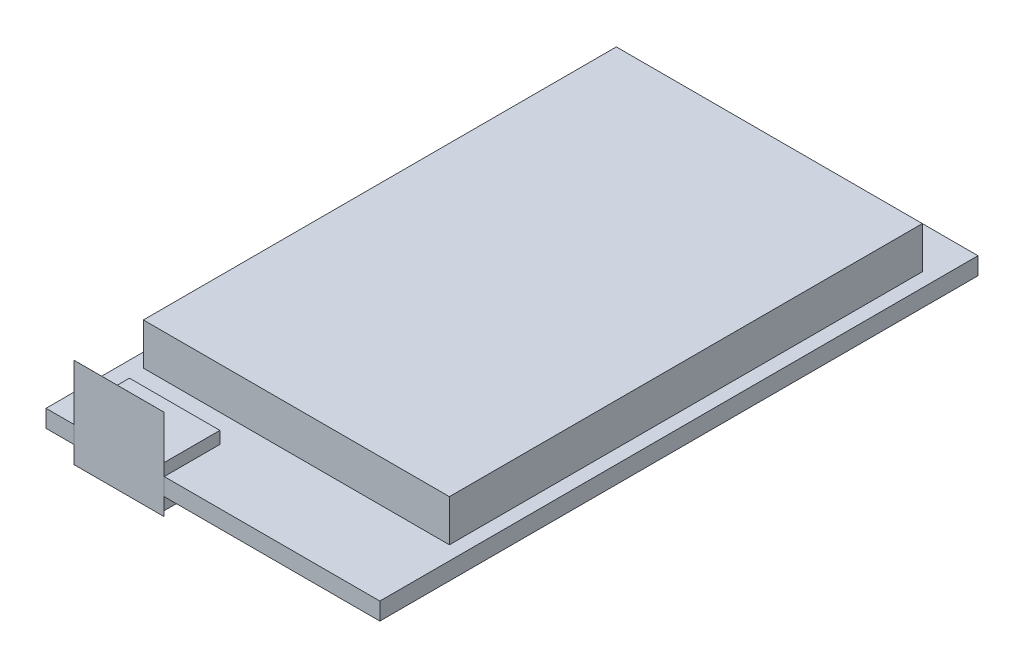
ISO-10303-21;
HEADER;
FILE_DESCRIPTION(('STEP AP214'),'2;1');
FILE_NAME('part.step','',(''),(''),'','','');
FILE_SCHEMA(('AUTOMOTIVE_DESIGN { 1 0 10303 214 1 1 1 1 }'));
ENDSEC;
DATA;
#1=APPLICATION_CONTEXT('core data for automotive mechanical design processes');
#2=APPLICATION_PROTOCOL_DEFINITION('international standard','automotive_design',2000,#1);
#3=PRODUCT_CONTEXT('',#1,'mechanical');
#4=PRODUCT('Part','Part','',(#3));
#5=PRODUCT_RELATED_PRODUCT_CATEGORY('part','',(#4));
#6=PRODUCT_DEFINITION_FORMATION('','',#4);
#7=PRODUCT_DEFINITION_CONTEXT('part definition',#1,'design');
#8=PRODUCT_DEFINITION('design','',#6,#7);
#9=PRODUCT_DEFINITION_SHAPE('','',#8);
#10=(LENGTH_UNIT() NAMED_UNIT(*) SI_UNIT(.MILLI.,.METRE.));
#11=(NAMED_UNIT(*) PLANE_ANGLE_UNIT() SI_UNIT($,.RADIAN.));
#12=(NAMED_UNIT(*) SI_UNIT($,.STERADIAN.) SOLID_ANGLE_UNIT());
#13=UNCERTAINTY_MEASURE_WITH_UNIT(LENGTH_MEASURE(1.E-05),#10,'distance_accuracy_value','');
#14=(GEOMETRIC_REPRESENTATION_CONTEXT(3) GLOBAL_UNCERTAINTY_ASSIGNED_CONTEXT((#13)) GLOBAL_UNIT_ASSIGNED_CONTEXT((#10,
#11,#12)) REPRESENTATION_CONTEXT('',''));
#15=CARTESIAN_POINT('',(0.,0.,0.));
#16=DIRECTION('',(0.,0.,1.));
#17=DIRECTION('',(1.,0.,0.));
#18=AXIS2_PLACEMENT_3D('',#15,#16,#17);
#19=CARTESIAN_POINT('',(0.,1.25,0.));
#20=DIRECTION('',(0.,1.,0.));
#21=DIRECTION('',(0.,0.,1.));
#22=AXIS2_PLACEMENT_3D('',#19,#20,#21);
#23=PLANE('',#22);
#24=DIRECTION('',(0.,0.,-1.));
#25=VECTOR('',#24,1.);
#26=CARTESIAN_POINT('',(11.,1.25,-18.5));
#27=LINE('',#26,#25);
#28=CARTESIAN_POINT('',(11.,1.25,15.5));
#29=VERTEX_POINT('',#28);
#30=CARTESIAN_POINT('',(11.,1.25,-18.5));
#31=VERTEX_POINT('',#30);
#32=EDGE_CURVE('E241',#29,#31,#27,.T.);
#33=ORIENTED_EDGE('',*,*,#32,.F.);
#34=DIRECTION('',(1.,0.,0.));
#35=VECTOR('',#34,1.);
#36=CARTESIAN_POINT('',(-11.,1.25,15.5));
#37=LINE('',#36,#35);
#38=CARTESIAN_POINT('',(-11.,1.25,15.5));
#39=VERTEX_POINT('',#38);
#40=EDGE_CURVE('E246',#39,#29,#37,.T.);
#41=ORIENTED_EDGE('',*,*,#40,.F.);
#42=DIRECTION('',(0.,0.,1.));
#43=VECTOR('',#42,1.);
#44=CARTESIAN_POINT('',(-11.,1.25,-18.5));
#45=LINE('',#44,#43);
#46=CARTESIAN_POINT('',(-11.,1.25,-18.5));
#47=VERTEX_POINT('',#46);
#48=EDGE_CURVE('E258',#47,#39,#45,.T.);
#49=ORIENTED_EDGE('',*,*,#48,.F.);
#50=DIRECTION('',(-1.,0.,0.));
#51=VECTOR('',#50,1.);
#52=CARTESIAN_POINT('',(-11.,1.25,-18.5));
#53=LINE('',#52,#51);
#54=EDGE_CURVE('E255',#31,#47,#53,.T.);
#55=ORIENTED_EDGE('',*,*,#54,.F.);
#56=EDGE_LOOP('',(#33,#41,#49,#55));
#57=FACE_BOUND('',#56,.T.);
#58=DIRECTION('',(1.,0.,0.));
#59=VECTOR('',#58,1.);
#60=CARTESIAN_POINT('',(-12.,1.25,21.5));
#61=LINE('',#60,#59);
#62=CARTESIAN_POINT('',(-12.,1.25,21.5));
#63=VERTEX_POINT('',#62);
#64=CARTESIAN_POINT('',(-10.,1.25,21.5));
#65=VERTEX_POINT('',#64);
#66=EDGE_CURVE('E284',#63,#65,#61,.T.);
#67=ORIENTED_EDGE('',*,*,#66,.T.);
#68=DIRECTION('',(0.,0.,-1.));
#69=VECTOR('',#68,1.);
#70=CARTESIAN_POINT('',(-10.,1.25,0.));
#71=LINE('',#70,#69);
#72=CARTESIAN_POINT('',(-10.,1.25,17.5));
#73=VERTEX_POINT('',#72);
#74=EDGE_CURVE('E207',#65,#73,#71,.T.);
#75=ORIENTED_EDGE('',*,*,#74,.T.);
#76=DIRECTION('',(-1.,0.,0.));
#77=VECTOR('',#76,1.);
#78=CARTESIAN_POINT('',(0.,1.25,17.5));
#79=LINE('',#78,#77);
#80=CARTESIAN_POINT('',(-3.5,1.25,17.5));
#81=VERTEX_POINT('',#80);
#82=EDGE_CURVE('E179',#81,#73,#79,.T.);
#83=ORIENTED_EDGE('',*,*,#82,.F.);
#84=DIRECTION('',(0.,0.,1.));
#85=VECTOR('',#84,1.);
#86=CARTESIAN_POINT('',(-3.5,1.25,0.));
#87=LINE('',#86,#85);
#88=CARTESIAN_POINT('',(-3.5,1.25,21.5));
#89=VERTEX_POINT('',#88);
#90=EDGE_CURVE('E198',#81,#89,#87,.T.);
#91=ORIENTED_EDGE('',*,*,#90,.T.);
#92=CARTESIAN_POINT('',(12.,1.25,21.5));
#93=VERTEX_POINT('',#92);
#94=EDGE_CURVE('E283',#89,#93,#61,.T.);
#95=ORIENTED_EDGE('',*,*,#94,.T.);
#96=DIRECTION('',(0.,0.,-1.));
#97=VECTOR('',#96,1.);
#98=CARTESIAN_POINT('',(12.,1.25,-21.5));
#99=LINE('',#98,#97);
#100=CARTESIAN_POINT('',(12.,1.25,-21.5));
#101=VERTEX_POINT('',#100);
#102=EDGE_CURVE('E275',#93,#101,#99,.T.);
#103=ORIENTED_EDGE('',*,*,#102,.T.);
#104=DIRECTION('',(-1.,0.,0.));
#105=VECTOR('',#104,1.);
#106=CARTESIAN_POINT('',(-12.,1.25,-21.5));
#107=LINE('',#106,#105);
#108=CARTESIAN_POINT('',(-12.,1.25,-21.5));
#109=VERTEX_POINT('',#108);
#110=EDGE_CURVE('E278',#101,#109,#107,.T.);
#111=ORIENTED_EDGE('',*,*,#110,.T.);
#112=DIRECTION('',(0.,0.,1.));
#113=VECTOR('',#112,1.);
#114=CARTESIAN_POINT('',(-12.,1.25,-21.5));
#115=LINE('',#114,#113);
#116=EDGE_CURVE('E281',#109,#63,#115,.T.);
#117=ORIENTED_EDGE('',*,*,#116,.T.);
#118=EDGE_LOOP('',(#67,#75,#83,#91,#95,#103,#111,#117));
#119=FACE_BOUND('',#118,.T.);
#120=ADVANCED_FACE('F35',(#57,#119),#23,.T.);
#121=CARTESIAN_POINT('',(0.,0.,0.));
#122=DIRECTION('',(0.,1.,0.));
#123=DIRECTION('',(0.,0.,1.));
#124=AXIS2_PLACEMENT_3D('',#121,#122,#123);
#125=PLANE('',#124);
#126=DIRECTION('',(0.,0.,-1.));
#127=VECTOR('',#126,1.);
#128=CARTESIAN_POINT('',(-10.,0.,0.));
#129=LINE('',#128,#127);
#130=CARTESIAN_POINT('',(-10.,0.,21.5));
#131=VERTEX_POINT('',#130);
#132=CARTESIAN_POINT('',(-10.,0.,17.5));
#133=VERTEX_POINT('',#132);
#134=EDGE_CURVE('E205',#131,#133,#129,.T.);
#135=ORIENTED_EDGE('',*,*,#134,.F.);
#136=DIRECTION('',(1.,0.,0.));
#137=VECTOR('',#136,1.);
#138=CARTESIAN_POINT('',(-12.,0.,21.5));
#139=LINE('',#138,#137);
#140=CARTESIAN_POINT('',(-12.,0.,21.5));
#141=VERTEX_POINT('',#140);
#142=EDGE_CURVE('E279',#141,#131,#139,.T.);
#143=ORIENTED_EDGE('',*,*,#142,.F.);
#144=DIRECTION('',(0.,0.,1.));
#145=VECTOR('',#144,1.);
#146=CARTESIAN_POINT('',(-12.,0.,-21.5));
#147=LINE('',#146,#145);
#148=CARTESIAN_POINT('',(-12.,0.,-21.5));
#149=VERTEX_POINT('',#148);
#150=EDGE_CURVE('E292',#149,#141,#147,.T.);
#151=ORIENTED_EDGE('',*,*,#150,.F.);
#152=DIRECTION('',(-1.,0.,0.));
#153=VECTOR('',#152,1.);
#154=CARTESIAN_POINT('',(-12.,0.,-21.5));
#155=LINE('',#154,#153);
#156=CARTESIAN_POINT('',(12.,0.,-21.5));
#157=VERTEX_POINT('',#156);
#158=EDGE_CURVE('E290',#157,#149,#155,.T.);
#159=ORIENTED_EDGE('',*,*,#158,.F.);
#160=DIRECTION('',(0.,0.,-1.));
#161=VECTOR('',#160,1.);
#162=CARTESIAN_POINT('',(12.,0.,-21.5));
#163=LINE('',#162,#161);
#164=CARTESIAN_POINT('',(12.,0.,21.5));
#165=VERTEX_POINT('',#164);
#166=EDGE_CURVE('E274',#165,#157,#163,.T.);
#167=ORIENTED_EDGE('',*,*,#166,.F.);
#168=CARTESIAN_POINT('',(-3.5,0.,21.5));
#169=VERTEX_POINT('',#168);
#170=EDGE_CURVE('E294',#169,#165,#139,.T.);
#171=ORIENTED_EDGE('',*,*,#170,.F.);
#172=DIRECTION('',(0.,0.,1.));
#173=VECTOR('',#172,1.);
#174=CARTESIAN_POINT('',(-3.5,0.,0.));
#175=LINE('',#174,#173);
#176=CARTESIAN_POINT('',(-3.5,0.,17.5));
#177=VERTEX_POINT('',#176);
#178=EDGE_CURVE('E196',#177,#169,#175,.T.);
#179=ORIENTED_EDGE('',*,*,#178,.F.);
#180=DIRECTION('',(-1.,0.,0.));
#181=VECTOR('',#180,1.);
#182=CARTESIAN_POINT('',(0.,0.,17.5));
#183=LINE('',#182,#181);
#184=EDGE_CURVE('E11',#177,#133,#183,.T.);
#185=ORIENTED_EDGE('',*,*,#184,.T.);
#186=EDGE_LOOP('',(#135,#143,#151,#159,#167,#171,#179,#185));
#187=FACE_BOUND('',#186,.T.);
#188=ADVANCED_FACE('F352',(#187),#125,.F.);
#189=CARTESIAN_POINT('',(0.,0.,21.5));
#190=DIRECTION('',(0.,0.,1.));
#191=DIRECTION('',(1.,0.,0.));
#192=AXIS2_PLACEMENT_3D('',#189,#190,#191);
#193=PLANE('',#192);
#194=DIRECTION('',(-1.,0.,0.));
#195=VECTOR('',#194,1.);
#196=CARTESIAN_POINT('',(-3.5,-0.875,21.5));
#197=LINE('',#196,#195);
#198=CARTESIAN_POINT('',(-3.5,-0.875,21.5));
#199=VERTEX_POINT('',#198);
#200=CARTESIAN_POINT('',(-10.,-0.874999999999998,21.5));
#201=VERTEX_POINT('',#200);
#202=EDGE_CURVE('E183',#199,#201,#197,.T.);
#203=ORIENTED_EDGE('',*,*,#202,.F.);
#204=DIRECTION('',(0.,1.,0.));
#205=VECTOR('',#204,1.);
#206=CARTESIAN_POINT('',(-3.5,5.25,21.5));
#207=LINE('',#206,#205);
#208=CARTESIAN_POINT('',(-3.5,-1.25,21.5));
#209=VERTEX_POINT('',#208);
#210=EDGE_CURVE('E222',#209,#199,#207,.T.);
#211=ORIENTED_EDGE('',*,*,#210,.F.);
#212=DIRECTION('',(1.,0.,0.));
#213=VECTOR('',#212,1.);
#214=CARTESIAN_POINT('',(-10.,-1.25,21.5));
#215=LINE('',#214,#213);
#216=CARTESIAN_POINT('',(-10.,-1.25,21.5));
#217=VERTEX_POINT('',#216);
#218=EDGE_CURVE('E215',#217,#209,#215,.T.);
#219=ORIENTED_EDGE('',*,*,#218,.F.);
#220=DIRECTION('',(0.,-1.,0.));
#221=VECTOR('',#220,1.);
#222=CARTESIAN_POINT('',(-10.,5.25,21.5));
#223=LINE('',#222,#221);
#224=EDGE_CURVE('E227',#201,#217,#223,.T.);
#225=ORIENTED_EDGE('',*,*,#224,.F.);
#226=EDGE_LOOP('',(#203,#211,#219,#225));
#227=FACE_BOUND('',#226,.T.);
#228=ADVANCED_FACE('F322',(#227),#193,.F.);
#229=DIRECTION('',(1.,0.,0.));
#230=VECTOR('',#229,1.);
#231=CARTESIAN_POINT('',(-3.5,2.125,21.5));
#232=LINE('',#231,#230);
#233=CARTESIAN_POINT('',(-10.,2.125,21.5));
#234=VERTEX_POINT('',#233);
#235=CARTESIAN_POINT('',(-3.5,2.125,21.5));
#236=VERTEX_POINT('',#235);
#237=EDGE_CURVE('E337',#234,#236,#232,.T.);
#238=ORIENTED_EDGE('',*,*,#237,.F.);
#239=CARTESIAN_POINT('',(-10.,5.25,21.5));
#240=VERTEX_POINT('',#239);
#241=EDGE_CURVE('E195',#240,#234,#223,.T.);
#242=ORIENTED_EDGE('',*,*,#241,.F.);
#243=DIRECTION('',(-1.,0.,0.));
#244=VECTOR('',#243,1.);
#245=CARTESIAN_POINT('',(-10.,5.25,21.5));
#246=LINE('',#245,#244);
#247=CARTESIAN_POINT('',(-3.5,5.25,21.5));
#248=VERTEX_POINT('',#247);
#249=EDGE_CURVE('E225',#248,#240,#246,.T.);
#250=ORIENTED_EDGE('',*,*,#249,.F.);
#251=EDGE_CURVE('E210',#236,#248,#207,.T.);
#252=ORIENTED_EDGE('',*,*,#251,.F.);
#253=EDGE_LOOP('',(#238,#242,#250,#252));
#254=FACE_BOUND('',#253,.T.);
#255=ADVANCED_FACE('F335',(#254),#193,.F.);
#256=CARTESIAN_POINT('',(-12.,1.25,21.5));
#257=DIRECTION('',(0.,0.,-1.));
#258=DIRECTION('',(-1.,0.,0.));
#259=AXIS2_PLACEMENT_3D('',#256,#257,#258);
#260=PLANE('',#259);
#261=EDGE_CURVE('E43',#169,#89,#207,.T.);
#262=ORIENTED_EDGE('',*,*,#261,.F.);
#263=ORIENTED_EDGE('',*,*,#170,.T.);
#264=DIRECTION('',(0.,-1.,0.));
#265=VECTOR('',#264,1.);
#266=CARTESIAN_POINT('',(12.,1.25,21.5));
#267=LINE('',#266,#265);
#268=EDGE_CURVE('E287',#93,#165,#267,.T.);
#269=ORIENTED_EDGE('',*,*,#268,.F.);
#270=ORIENTED_EDGE('',*,*,#94,.F.);
#271=EDGE_LOOP('',(#262,#263,#269,#270));
#272=FACE_BOUND('',#271,.T.);
#273=ADVANCED_FACE('F359',(#272),#260,.F.);
#274=EDGE_CURVE('E229',#65,#131,#223,.T.);
#275=ORIENTED_EDGE('',*,*,#274,.F.);
#276=ORIENTED_EDGE('',*,*,#66,.F.);
#277=DIRECTION('',(0.,-1.,0.));
#278=VECTOR('',#277,1.);
#279=CARTESIAN_POINT('',(-12.,1.25,21.5));
#280=LINE('',#279,#278);
#281=EDGE_CURVE('E299',#63,#141,#280,.T.);
#282=ORIENTED_EDGE('',*,*,#281,.T.);
#283=ORIENTED_EDGE('',*,*,#142,.T.);
#284=EDGE_LOOP('',(#275,#276,#282,#283));
#285=FACE_BOUND('',#284,.T.);
#286=ADVANCED_FACE('F365',(#285),#260,.F.);
#287=CARTESIAN_POINT('',(12.,1.25,-21.5));
#288=DIRECTION('',(-1.,0.,0.));
#289=DIRECTION('',(0.,0.,1.));
#290=AXIS2_PLACEMENT_3D('',#287,#288,#289);
#291=PLANE('',#290);
#292=ORIENTED_EDGE('',*,*,#166,.T.);
#293=DIRECTION('',(0.,-1.,0.));
#294=VECTOR('',#293,1.);
#295=CARTESIAN_POINT('',(12.,1.25,-21.5));
#296=LINE('',#295,#294);
#297=EDGE_CURVE('E304',#101,#157,#296,.T.);
#298=ORIENTED_EDGE('',*,*,#297,.F.);
#299=ORIENTED_EDGE('',*,*,#102,.F.);
#300=ORIENTED_EDGE('',*,*,#268,.T.);
#301=EDGE_LOOP('',(#292,#298,#299,#300));
#302=FACE_BOUND('',#301,.T.);
#303=ADVANCED_FACE('F37',(#302),#291,.F.);
#304=CARTESIAN_POINT('',(-12.,1.25,-21.5));
#305=DIRECTION('',(0.,0.,1.));
#306=DIRECTION('',(1.,0.,0.));
#307=AXIS2_PLACEMENT_3D('',#304,#305,#306);
#308=PLANE('',#307);
#309=ORIENTED_EDGE('',*,*,#158,.T.);
#310=DIRECTION('',(0.,-1.,0.));
#311=VECTOR('',#310,1.);
#312=CARTESIAN_POINT('',(-12.,1.25,-21.5));
#313=LINE('',#312,#311);
#314=EDGE_CURVE('E302',#109,#149,#313,.T.);
#315=ORIENTED_EDGE('',*,*,#314,.F.);
#316=ORIENTED_EDGE('',*,*,#110,.F.);
#317=ORIENTED_EDGE('',*,*,#297,.T.);
#318=EDGE_LOOP('',(#309,#315,#316,#317));
#319=FACE_BOUND('',#318,.T.);
#320=ADVANCED_FACE('F372',(#319),#308,.F.);
#321=CARTESIAN_POINT('',(-12.,1.25,-21.5));
#322=DIRECTION('',(1.,0.,0.));
#323=DIRECTION('',(0.,0.,-1.));
#324=AXIS2_PLACEMENT_3D('',#321,#322,#323);
#325=PLANE('',#324);
#326=ORIENTED_EDGE('',*,*,#150,.T.);
#327=ORIENTED_EDGE('',*,*,#281,.F.);
#328=ORIENTED_EDGE('',*,*,#116,.F.);
#329=ORIENTED_EDGE('',*,*,#314,.T.);
#330=EDGE_LOOP('',(#326,#327,#328,#329));
#331=FACE_BOUND('',#330,.T.);
#332=ADVANCED_FACE('F369',(#331),#325,.F.);
#333=CARTESIAN_POINT('',(11.,4.25,-18.5));
#334=DIRECTION('',(-1.,0.,0.));
#335=DIRECTION('',(0.,0.,1.));
#336=AXIS2_PLACEMENT_3D('',#333,#334,#335);
#337=PLANE('',#336);
#338=ORIENTED_EDGE('',*,*,#32,.T.);
#339=DIRECTION('',(0.,-1.,0.));
#340=VECTOR('',#339,1.);
#341=CARTESIAN_POINT('',(11.,4.25,-18.5));
#342=LINE('',#341,#340);
#343=CARTESIAN_POINT('',(11.,4.25,-18.5));
#344=VERTEX_POINT('',#343);
#345=EDGE_CURVE('E271',#344,#31,#342,.T.);
#346=ORIENTED_EDGE('',*,*,#345,.F.);
#347=DIRECTION('',(0.,0.,-1.));
#348=VECTOR('',#347,1.);
#349=CARTESIAN_POINT('',(11.,4.25,-18.5));
#350=LINE('',#349,#348);
#351=CARTESIAN_POINT('',(11.,4.25,15.5));
#352=VERTEX_POINT('',#351);
#353=EDGE_CURVE('E242',#352,#344,#350,.T.);
#354=ORIENTED_EDGE('',*,*,#353,.F.);
#355=DIRECTION('',(0.,-1.,0.));
#356=VECTOR('',#355,1.);
#357=CARTESIAN_POINT('',(11.,4.25,15.5));
#358=LINE('',#357,#356);
#359=EDGE_CURVE('E252',#352,#29,#358,.T.);
#360=ORIENTED_EDGE('',*,*,#359,.T.);
#361=EDGE_LOOP('',(#338,#346,#354,#360));
#362=FACE_BOUND('',#361,.T.);
#363=ADVANCED_FACE('F378',(#362),#337,.F.);
#364=CARTESIAN_POINT('',(-11.,4.25,-18.5));
#365=DIRECTION('',(0.,0.,1.));
#366=DIRECTION('',(1.,0.,0.));
#367=AXIS2_PLACEMENT_3D('',#364,#365,#366);
#368=PLANE('',#367);
#369=ORIENTED_EDGE('',*,*,#54,.T.);
#370=DIRECTION('',(0.,-1.,0.));
#371=VECTOR('',#370,1.);
#372=CARTESIAN_POINT('',(-11.,4.25,-18.5));
#373=LINE('',#372,#371);
#374=CARTESIAN_POINT('',(-11.,4.25,-18.5));
#375=VERTEX_POINT('',#374);
#376=EDGE_CURVE('E268',#375,#47,#373,.T.);
#377=ORIENTED_EDGE('',*,*,#376,.F.);
#378=DIRECTION('',(-1.,0.,0.));
#379=VECTOR('',#378,1.);
#380=CARTESIAN_POINT('',(-11.,4.25,-18.5));
#381=LINE('',#380,#379);
#382=EDGE_CURVE('E245',#344,#375,#381,.T.);
#383=ORIENTED_EDGE('',*,*,#382,.F.);
#384=ORIENTED_EDGE('',*,*,#345,.T.);
#385=EDGE_LOOP('',(#369,#377,#383,#384));
#386=FACE_BOUND('',#385,.T.);
#387=ADVANCED_FACE('F423',(#386),#368,.F.);
#388=CARTESIAN_POINT('',(-11.,4.25,-18.5));
#389=DIRECTION('',(1.,0.,0.));
#390=DIRECTION('',(0.,0.,-1.));
#391=AXIS2_PLACEMENT_3D('',#388,#389,#390);
#392=PLANE('',#391);
#393=ORIENTED_EDGE('',*,*,#48,.T.);
#394=DIRECTION('',(0.,-1.,0.));
#395=VECTOR('',#394,1.);
#396=CARTESIAN_POINT('',(-11.,4.25,15.5));
#397=LINE('',#396,#395);
#398=CARTESIAN_POINT('',(-11.,4.25,15.5));
#399=VERTEX_POINT('',#398);
#400=EDGE_CURVE('E265',#399,#39,#397,.T.);
#401=ORIENTED_EDGE('',*,*,#400,.F.);
#402=DIRECTION('',(0.,0.,1.));
#403=VECTOR('',#402,1.);
#404=CARTESIAN_POINT('',(-11.,4.25,-18.5));
#405=LINE('',#404,#403);
#406=EDGE_CURVE('E248',#375,#399,#405,.T.);
#407=ORIENTED_EDGE('',*,*,#406,.F.);
#408=ORIENTED_EDGE('',*,*,#376,.T.);
#409=EDGE_LOOP('',(#393,#401,#407,#408));
#410=FACE_BOUND('',#409,.T.);
#411=ADVANCED_FACE('F420',(#410),#392,.F.);
#412=CARTESIAN_POINT('',(-11.,4.25,15.5));
#413=DIRECTION('',(0.,0.,-1.));
#414=DIRECTION('',(-1.,0.,0.));
#415=AXIS2_PLACEMENT_3D('',#412,#413,#414);
#416=PLANE('',#415);
#417=ORIENTED_EDGE('',*,*,#40,.T.);
#418=ORIENTED_EDGE('',*,*,#359,.F.);
#419=DIRECTION('',(1.,0.,0.));
#420=VECTOR('',#419,1.);
#421=CARTESIAN_POINT('',(-11.,4.25,15.5));
#422=LINE('',#421,#420);
#423=EDGE_CURVE('E250',#399,#352,#422,.T.);
#424=ORIENTED_EDGE('',*,*,#423,.F.);
#425=ORIENTED_EDGE('',*,*,#400,.T.);
#426=EDGE_LOOP('',(#417,#418,#424,#425));
#427=FACE_BOUND('',#426,.T.);
#428=ADVANCED_FACE('F416',(#427),#416,.F.);
#429=CARTESIAN_POINT('',(0.,4.25,0.));
#430=DIRECTION('',(0.,1.,0.));
#431=DIRECTION('',(0.,0.,1.));
#432=AXIS2_PLACEMENT_3D('',#429,#430,#431);
#433=PLANE('',#432);
#434=ORIENTED_EDGE('',*,*,#353,.T.);
#435=ORIENTED_EDGE('',*,*,#382,.T.);
#436=ORIENTED_EDGE('',*,*,#406,.T.);
#437=ORIENTED_EDGE('',*,*,#423,.T.);
#438=EDGE_LOOP('',(#434,#435,#436,#437));
#439=FACE_BOUND('',#438,.T.);
#440=ADVANCED_FACE('F413',(#439),#433,.T.);
#441=CARTESIAN_POINT('',(-3.5,5.25,21.501));
#442=DIRECTION('',(-1.,0.,0.));
#443=DIRECTION('',(0.,0.,1.));
#444=AXIS2_PLACEMENT_3D('',#441,#442,#443);
#445=PLANE('',#444);
#446=ORIENTED_EDGE('',*,*,#210,.T.);
#447=DIRECTION('',(0.,0.,1.));
#448=VECTOR('',#447,1.);
#449=CARTESIAN_POINT('',(-3.5,-0.875,17.5));
#450=LINE('',#449,#448);
#451=CARTESIAN_POINT('',(-3.5,-0.875,17.5));
#452=VERTEX_POINT('',#451);
#453=EDGE_CURVE('E200',#452,#199,#450,.T.);
#454=ORIENTED_EDGE('',*,*,#453,.F.);
#455=DIRECTION('',(0.,-1.,0.));
#456=VECTOR('',#455,1.);
#457=CARTESIAN_POINT('',(-3.5,2.125,17.5));
#458=LINE('',#457,#456);
#459=EDGE_CURVE('E189',#177,#452,#458,.T.);
#460=ORIENTED_EDGE('',*,*,#459,.F.);
#461=ORIENTED_EDGE('',*,*,#178,.T.);
#462=ORIENTED_EDGE('',*,*,#261,.T.);
#463=ORIENTED_EDGE('',*,*,#90,.F.);
#464=CARTESIAN_POINT('',(-3.5,2.125,17.5));
#465=VERTEX_POINT('',#464);
#466=EDGE_CURVE('E348',#465,#81,#458,.T.);
#467=ORIENTED_EDGE('',*,*,#466,.F.);
#468=DIRECTION('',(0.,0.,1.));
#469=VECTOR('',#468,1.);
#470=CARTESIAN_POINT('',(-3.5,2.125,17.5));
#471=LINE('',#470,#469);
#472=EDGE_CURVE('E58',#465,#236,#471,.T.);
#473=ORIENTED_EDGE('',*,*,#472,.T.);
#474=ORIENTED_EDGE('',*,*,#251,.T.);
#475=DIRECTION('',(0.,0.,-1.));
#476=VECTOR('',#475,1.);
#477=CARTESIAN_POINT('',(-3.5,5.25,21.501));
#478=LINE('',#477,#476);
#479=CARTESIAN_POINT('',(-3.5,5.25,21.501));
#480=VERTEX_POINT('',#479);
#481=EDGE_CURVE('E238',#480,#248,#478,.T.);
#482=ORIENTED_EDGE('',*,*,#481,.F.);
#483=DIRECTION('',(0.,1.,0.));
#484=VECTOR('',#483,1.);
#485=CARTESIAN_POINT('',(-3.5,5.25,21.501));
#486=LINE('',#485,#484);
#487=CARTESIAN_POINT('',(-3.5,-1.25,21.501));
#488=VERTEX_POINT('',#487);
#489=EDGE_CURVE('E211',#488,#480,#486,.T.);
#490=ORIENTED_EDGE('',*,*,#489,.F.);
#491=DIRECTION('',(0.,0.,-1.));
#492=VECTOR('',#491,1.);
#493=CARTESIAN_POINT('',(-3.5,-1.25,21.501));
#494=LINE('',#493,#492);
#495=EDGE_CURVE('E221',#488,#209,#494,.T.);
#496=ORIENTED_EDGE('',*,*,#495,.T.);
#497=EDGE_LOOP('',(#446,#454,#460,#461,#462,#463,#467,#473,#474,#482,#490,#496));
#498=FACE_BOUND('',#497,.T.);
#499=ADVANCED_FACE('F324',(#498),#445,.F.);
#500=CARTESIAN_POINT('',(-10.,5.25,21.501));
#501=DIRECTION('',(0.,-1.,0.));
#502=DIRECTION('',(0.,0.,-1.));
#503=AXIS2_PLACEMENT_3D('',#500,#501,#502);
#504=PLANE('',#503);
#505=ORIENTED_EDGE('',*,*,#249,.T.);
#506=DIRECTION('',(0.,0.,-1.));
#507=VECTOR('',#506,1.);
#508=CARTESIAN_POINT('',(-10.,5.25,21.501));
#509=LINE('',#508,#507);
#510=CARTESIAN_POINT('',(-10.,5.25,21.501));
#511=VERTEX_POINT('',#510);
#512=EDGE_CURVE('E236',#511,#240,#509,.T.);
#513=ORIENTED_EDGE('',*,*,#512,.F.);
#514=DIRECTION('',(-1.,0.,0.));
#515=VECTOR('',#514,1.);
#516=CARTESIAN_POINT('',(-10.,5.25,21.501));
#517=LINE('',#516,#515);
#518=EDGE_CURVE('E214',#480,#511,#517,.T.);
#519=ORIENTED_EDGE('',*,*,#518,.F.);
#520=ORIENTED_EDGE('',*,*,#481,.T.);
#521=EDGE_LOOP('',(#505,#513,#519,#520));
#522=FACE_BOUND('',#521,.T.);
#523=ADVANCED_FACE('F409',(#522),#504,.F.);
#524=CARTESIAN_POINT('',(-10.,5.25,21.501));
#525=DIRECTION('',(1.,0.,0.));
#526=DIRECTION('',(0.,0.,-1.));
#527=AXIS2_PLACEMENT_3D('',#524,#525,#526);
#528=PLANE('',#527);
#529=ORIENTED_EDGE('',*,*,#241,.T.);
#530=DIRECTION('',(0.,0.,1.));
#531=VECTOR('',#530,1.);
#532=CARTESIAN_POINT('',(-10.,2.125,17.5));
#533=LINE('',#532,#531);
#534=CARTESIAN_POINT('',(-10.,2.125,17.5));
#535=VERTEX_POINT('',#534);
#536=EDGE_CURVE('E187',#535,#234,#533,.T.);
#537=ORIENTED_EDGE('',*,*,#536,.F.);
#538=DIRECTION('',(0.,1.,0.));
#539=VECTOR('',#538,1.);
#540=CARTESIAN_POINT('',(-10.,2.125,17.5));
#541=LINE('',#540,#539);
#542=EDGE_CURVE('E173',#73,#535,#541,.T.);
#543=ORIENTED_EDGE('',*,*,#542,.F.);
#544=ORIENTED_EDGE('',*,*,#74,.F.);
#545=ORIENTED_EDGE('',*,*,#274,.T.);
#546=ORIENTED_EDGE('',*,*,#134,.T.);
#547=CARTESIAN_POINT('',(-10.,-0.875,17.5));
#548=VERTEX_POINT('',#547);
#549=EDGE_CURVE('E182',#548,#133,#541,.T.);
#550=ORIENTED_EDGE('',*,*,#549,.F.);
#551=DIRECTION('',(0.,0.,1.));
#552=VECTOR('',#551,1.);
#553=CARTESIAN_POINT('',(-10.,-0.875,17.5));
#554=LINE('',#553,#552);
#555=EDGE_CURVE('E50',#548,#201,#554,.T.);
#556=ORIENTED_EDGE('',*,*,#555,.T.);
#557=ORIENTED_EDGE('',*,*,#224,.T.);
#558=DIRECTION('',(0.,0.,-1.));
#559=VECTOR('',#558,1.);
#560=CARTESIAN_POINT('',(-10.,-1.25,21.501));
#561=LINE('',#560,#559);
#562=CARTESIAN_POINT('',(-10.,-1.25,21.501));
#563=VERTEX_POINT('',#562);
#564=EDGE_CURVE('E233',#563,#217,#561,.T.);
#565=ORIENTED_EDGE('',*,*,#564,.F.);
#566=DIRECTION('',(0.,-1.,0.));
#567=VECTOR('',#566,1.);
#568=CARTESIAN_POINT('',(-10.,5.25,21.501));
#569=LINE('',#568,#567);
#570=EDGE_CURVE('E217',#511,#563,#569,.T.);
#571=ORIENTED_EDGE('',*,*,#570,.F.);
#572=ORIENTED_EDGE('',*,*,#512,.T.);
#573=EDGE_LOOP('',(#529,#537,#543,#544,#545,#546,#550,#556,#557,#565,#571,#572));
#574=FACE_BOUND('',#573,.T.);
#575=ADVANCED_FACE('F192',(#574),#528,.F.);
#576=CARTESIAN_POINT('',(-10.,-1.25,21.501));
#577=DIRECTION('',(0.,1.,0.));
#578=DIRECTION('',(-1.,0.,0.));
#579=AXIS2_PLACEMENT_3D('',#576,#577,#578);
#580=PLANE('',#579);
#581=ORIENTED_EDGE('',*,*,#218,.T.);
#582=ORIENTED_EDGE('',*,*,#495,.F.);
#583=DIRECTION('',(1.,0.,0.));
#584=VECTOR('',#583,1.);
#585=CARTESIAN_POINT('',(-10.,-1.25,21.501));
#586=LINE('',#585,#584);
#587=EDGE_CURVE('E219',#563,#488,#586,.T.);
#588=ORIENTED_EDGE('',*,*,#587,.F.);
#589=ORIENTED_EDGE('',*,*,#564,.T.);
#590=EDGE_LOOP('',(#581,#582,#588,#589));
#591=FACE_BOUND('',#590,.T.);
#592=ADVANCED_FACE('F319',(#591),#580,.F.);
#593=CARTESIAN_POINT('',(0.,0.,21.501));
#594=DIRECTION('',(0.,0.,1.));
#595=DIRECTION('',(1.,0.,0.));
#596=AXIS2_PLACEMENT_3D('',#593,#594,#595);
#597=PLANE('',#596);
#598=ORIENTED_EDGE('',*,*,#489,.T.);
#599=ORIENTED_EDGE('',*,*,#518,.T.);
#600=ORIENTED_EDGE('',*,*,#570,.T.);
#601=ORIENTED_EDGE('',*,*,#587,.T.);
#602=EDGE_LOOP('',(#598,#599,#600,#601));
#603=FACE_BOUND('',#602,.T.);
#604=ADVANCED_FACE('F330',(#603),#597,.T.);
#605=CARTESIAN_POINT('',(-3.5,2.125,17.5));
#606=DIRECTION('',(0.,-1.,0.));
#607=DIRECTION('',(0.,0.,-1.));
#608=AXIS2_PLACEMENT_3D('',#605,#606,#607);
#609=PLANE('',#608);
#610=ORIENTED_EDGE('',*,*,#237,.T.);
#611=ORIENTED_EDGE('',*,*,#472,.F.);
#612=DIRECTION('',(1.,0.,0.));
#613=VECTOR('',#612,1.);
#614=CARTESIAN_POINT('',(-3.5,2.125,17.5));
#615=LINE('',#614,#613);
#616=EDGE_CURVE('E177',#535,#465,#615,.T.);
#617=ORIENTED_EDGE('',*,*,#616,.F.);
#618=ORIENTED_EDGE('',*,*,#536,.T.);
#619=EDGE_LOOP('',(#610,#611,#617,#618));
#620=FACE_BOUND('',#619,.T.);
#621=ADVANCED_FACE('F186',(#620),#609,.F.);
#622=CARTESIAN_POINT('',(0.,0.,17.5));
#623=DIRECTION('',(0.,0.,-1.));
#624=DIRECTION('',(-1.,0.,0.));
#625=AXIS2_PLACEMENT_3D('',#622,#623,#624);
#626=PLANE('',#625);
#627=ORIENTED_EDGE('',*,*,#466,.T.);
#628=ORIENTED_EDGE('',*,*,#82,.T.);
#629=ORIENTED_EDGE('',*,*,#542,.T.);
#630=ORIENTED_EDGE('',*,*,#616,.T.);
#631=EDGE_LOOP('',(#627,#628,#629,#630));
#632=FACE_BOUND('',#631,.T.);
#633=ADVANCED_FACE('F176',(#632),#626,.T.);
#634=ORIENTED_EDGE('',*,*,#184,.F.);
#635=ORIENTED_EDGE('',*,*,#459,.T.);
#636=DIRECTION('',(-1.,0.,0.));
#637=VECTOR('',#636,1.);
#638=CARTESIAN_POINT('',(-3.5,-0.875,17.5));
#639=LINE('',#638,#637);
#640=EDGE_CURVE('E341',#452,#548,#639,.T.);
#641=ORIENTED_EDGE('',*,*,#640,.T.);
#642=ORIENTED_EDGE('',*,*,#549,.T.);
#643=EDGE_LOOP('',(#634,#635,#641,#642));
#644=FACE_BOUND('',#643,.T.);
#645=ADVANCED_FACE('F349',(#644),#626,.T.);
#646=CARTESIAN_POINT('',(-3.5,-0.875,17.5));
#647=DIRECTION('',(0.,1.,0.));
#648=DIRECTION('',(0.,0.,1.));
#649=AXIS2_PLACEMENT_3D('',#646,#647,#648);
#650=PLANE('',#649);
#651=ORIENTED_EDGE('',*,*,#202,.T.);
#652=ORIENTED_EDGE('',*,*,#555,.F.);
#653=ORIENTED_EDGE('',*,*,#640,.F.);
#654=ORIENTED_EDGE('',*,*,#453,.T.);
#655=EDGE_LOOP('',(#651,#652,#653,#654));
#656=FACE_BOUND('',#655,.T.);
#657=ADVANCED_FACE('F345',(#656),#650,.F.);
#658=CLOSED_SHELL('',(#120,#188,#228,#255,#273,#286,#303,#320,#332,#363,#387,#411,#428,#440,
#499,#523,#575,#592,#604,#621,#633,#645,#657));
#659=MANIFOLD_SOLID_BREP('B2',#658);
#660=ADVANCED_BREP_SHAPE_REPRESENTATION('',(#18,#659),#14);
#661=SHAPE_DEFINITION_REPRESENTATION(#9,#660);
ENDSEC;
END-ISO-10303-21;
